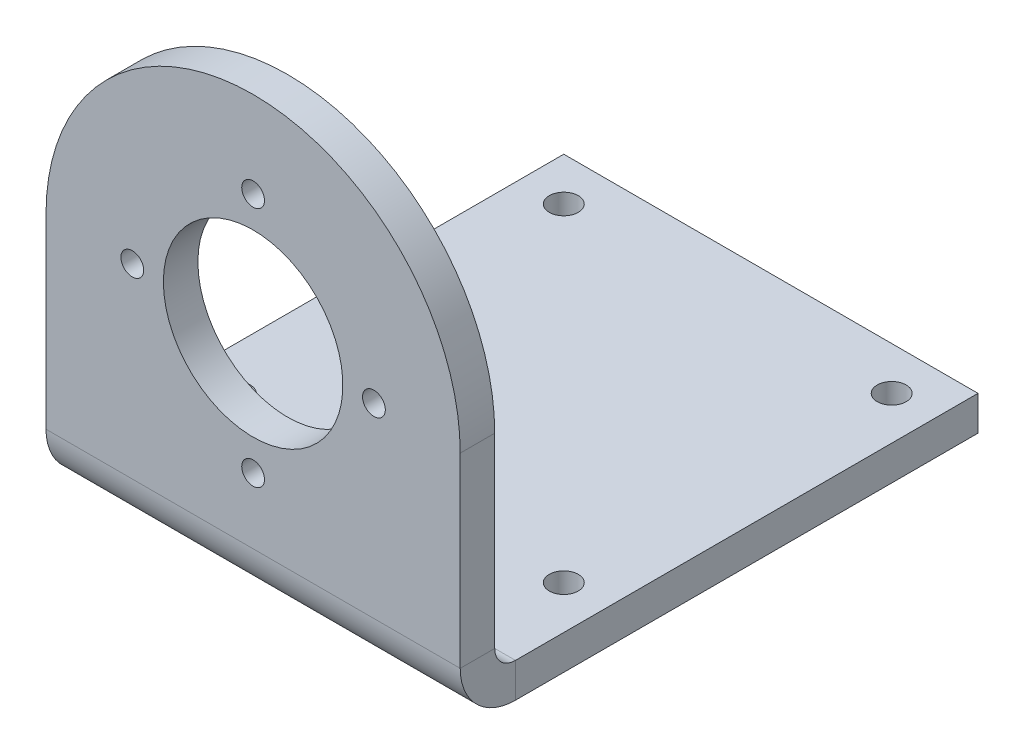
ISO-10303-21;
HEADER;
FILE_DESCRIPTION(('STEP AP214'),'2;1');
FILE_NAME('part.step','',(''),(''),'','','');
FILE_SCHEMA(('AUTOMOTIVE_DESIGN { 1 0 10303 214 1 1 1 1 }'));
ENDSEC;
DATA;
#1=APPLICATION_CONTEXT('core data for automotive mechanical design processes');
#2=APPLICATION_PROTOCOL_DEFINITION('international standard','automotive_design',2000,#1);
#3=PRODUCT_CONTEXT('',#1,'mechanical');
#4=PRODUCT('Part','Part','',(#3));
#5=PRODUCT_RELATED_PRODUCT_CATEGORY('part','',(#4));
#6=PRODUCT_DEFINITION_FORMATION('','',#4);
#7=PRODUCT_DEFINITION_CONTEXT('part definition',#1,'design');
#8=PRODUCT_DEFINITION('design','',#6,#7);
#9=PRODUCT_DEFINITION_SHAPE('','',#8);
#10=(LENGTH_UNIT() NAMED_UNIT(*) SI_UNIT(.MILLI.,.METRE.));
#11=(NAMED_UNIT(*) PLANE_ANGLE_UNIT() SI_UNIT($,.RADIAN.));
#12=(NAMED_UNIT(*) SI_UNIT($,.STERADIAN.) SOLID_ANGLE_UNIT());
#13=UNCERTAINTY_MEASURE_WITH_UNIT(LENGTH_MEASURE(1.E-05),#10,'distance_accuracy_value','');
#14=(GEOMETRIC_REPRESENTATION_CONTEXT(3) GLOBAL_UNCERTAINTY_ASSIGNED_CONTEXT((#13)) GLOBAL_UNIT_ASSIGNED_CONTEXT((#10,
#11,#12)) REPRESENTATION_CONTEXT('',''));
#15=CARTESIAN_POINT('',(0.,0.,0.));
#16=DIRECTION('',(0.,0.,1.));
#17=DIRECTION('',(1.,0.,0.));
#18=AXIS2_PLACEMENT_3D('',#15,#16,#17);
#19=CARTESIAN_POINT('',(-30.,-30.,-5.));
#20=DIRECTION('',(-1.,0.,0.));
#21=DIRECTION('',(0.,0.,1.));
#22=AXIS2_PLACEMENT_3D('',#19,#20,#21);
#23=PLANE('',#22);
#24=DIRECTION('',(0.,-1.,0.));
#25=VECTOR('',#24,1.);
#26=CARTESIAN_POINT('',(-30.,-30.,0.));
#27=LINE('',#26,#25);
#28=CARTESIAN_POINT('',(-30.,0.,0.));
#29=VERTEX_POINT('',#28);
#30=CARTESIAN_POINT('',(-30.,-27.,0.));
#31=VERTEX_POINT('',#30);
#32=EDGE_CURVE('E70',#29,#31,#27,.T.);
#33=ORIENTED_EDGE('',*,*,#32,.F.);
#34=DIRECTION('',(0.,0.,1.));
#35=VECTOR('',#34,1.);
#36=CARTESIAN_POINT('',(-30.,0.,-47.4264068711929));
#37=LINE('',#36,#35);
#38=CARTESIAN_POINT('',(-30.,0.,-5.));
#39=VERTEX_POINT('',#38);
#40=EDGE_CURVE('E142',#39,#29,#37,.T.);
#41=ORIENTED_EDGE('',*,*,#40,.F.);
#42=DIRECTION('',(0.,-1.,0.));
#43=VECTOR('',#42,1.);
#44=CARTESIAN_POINT('',(-30.,-30.,-5.));
#45=LINE('',#44,#43);
#46=CARTESIAN_POINT('',(-30.,-27.,-5.));
#47=VERTEX_POINT('',#46);
#48=EDGE_CURVE('E12',#39,#47,#45,.T.);
#49=ORIENTED_EDGE('',*,*,#48,.T.);
#50=DIRECTION('',(0.,0.,1.));
#51=VECTOR('',#50,1.);
#52=CARTESIAN_POINT('',(-30.,-27.,-5.));
#53=LINE('',#52,#51);
#54=EDGE_CURVE('E159',#47,#31,#53,.T.);
#55=ORIENTED_EDGE('',*,*,#54,.T.);
#56=EDGE_LOOP('',(#33,#41,#49,#55));
#57=FACE_BOUND('',#56,.T.);
#58=ADVANCED_FACE('F66',(#57),#23,.T.);
#59=CARTESIAN_POINT('',(0.,0.,-5.));
#60=DIRECTION('',(0.,0.,-1.));
#61=DIRECTION('',(-1.,0.,0.));
#62=AXIS2_PLACEMENT_3D('',#59,#60,#61);
#63=PLANE('',#62);
#64=CARTESIAN_POINT('',(0.,0.,-5.));
#65=DIRECTION('',(0.,0.,-1.));
#66=DIRECTION('',(-1.,0.,0.));
#67=AXIS2_PLACEMENT_3D('',#64,#65,#66);
#68=CIRCLE('',#67,30.);
#69=CARTESIAN_POINT('',(30.,0.,-5.));
#70=VERTEX_POINT('',#69);
#71=EDGE_CURVE('E134',#39,#70,#68,.T.);
#72=ORIENTED_EDGE('',*,*,#71,.T.);
#73=DIRECTION('',(0.,1.,0.));
#74=VECTOR('',#73,1.);
#75=CARTESIAN_POINT('',(30.,-30.,-5.));
#76=LINE('',#75,#74);
#77=CARTESIAN_POINT('',(30.,-27.,-5.));
#78=VERTEX_POINT('',#77);
#79=EDGE_CURVE('E76',#78,#70,#76,.T.);
#80=ORIENTED_EDGE('',*,*,#79,.F.);
#81=DIRECTION('',(-1.,0.,0.));
#82=VECTOR('',#81,1.);
#83=CARTESIAN_POINT('',(-30.,-27.,-5.));
#84=LINE('',#83,#82);
#85=EDGE_CURVE('E179',#47,#78,#84,.F.);
#86=ORIENTED_EDGE('',*,*,#85,.F.);
#87=ORIENTED_EDGE('',*,*,#48,.F.);
#88=EDGE_LOOP('',(#72,#80,#86,#87));
#89=FACE_BOUND('',#88,.T.);
#90=CARTESIAN_POINT('',(17.5,0.,-5.));
#91=DIRECTION('',(0.,0.,-1.));
#92=DIRECTION('',(-1.,0.,0.));
#93=AXIS2_PLACEMENT_3D('',#90,#91,#92);
#94=CIRCLE('',#93,1.65);
#95=CARTESIAN_POINT('',(15.85,0.,-5.));
#96=VERTEX_POINT('',#95);
#97=EDGE_CURVE('E247',#96,#96,#94,.T.);
#98=ORIENTED_EDGE('',*,*,#97,.F.);
#99=EDGE_LOOP('',(#98));
#100=FACE_BOUND('',#99,.T.);
#101=CARTESIAN_POINT('',(0.,17.5,-5.));
#102=DIRECTION('',(0.,0.,-1.));
#103=DIRECTION('',(-1.,0.,0.));
#104=AXIS2_PLACEMENT_3D('',#101,#102,#103);
#105=CIRCLE('',#104,1.65);
#106=CARTESIAN_POINT('',(-1.65,17.5,-5.));
#107=VERTEX_POINT('',#106);
#108=EDGE_CURVE('E237',#107,#107,#105,.T.);
#109=ORIENTED_EDGE('',*,*,#108,.F.);
#110=EDGE_LOOP('',(#109));
#111=FACE_BOUND('',#110,.T.);
#112=CARTESIAN_POINT('',(0.,-17.5,-5.));
#113=DIRECTION('',(0.,0.,-1.));
#114=DIRECTION('',(-1.,0.,0.));
#115=AXIS2_PLACEMENT_3D('',#112,#113,#114);
#116=CIRCLE('',#115,1.65);
#117=CARTESIAN_POINT('',(-1.65,-17.5,-5.));
#118=VERTEX_POINT('',#117);
#119=EDGE_CURVE('E246',#118,#118,#116,.T.);
#120=ORIENTED_EDGE('',*,*,#119,.F.);
#121=EDGE_LOOP('',(#120));
#122=FACE_BOUND('',#121,.T.);
#123=CARTESIAN_POINT('',(0.,0.,-5.));
#124=DIRECTION('',(0.,0.,-1.));
#125=DIRECTION('',(-1.,0.,0.));
#126=AXIS2_PLACEMENT_3D('',#123,#124,#125);
#127=CIRCLE('',#126,13.);
#128=CARTESIAN_POINT('',(-13.,0.,-5.));
#129=VERTEX_POINT('',#128);
#130=EDGE_CURVE('E255',#129,#129,#127,.T.);
#131=ORIENTED_EDGE('',*,*,#130,.F.);
#132=EDGE_LOOP('',(#131));
#133=FACE_BOUND('',#132,.T.);
#134=CARTESIAN_POINT('',(-17.5,0.,-5.));
#135=DIRECTION('',(0.,0.,-1.));
#136=DIRECTION('',(-1.,0.,0.));
#137=AXIS2_PLACEMENT_3D('',#134,#135,#136);
#138=CIRCLE('',#137,1.65);
#139=CARTESIAN_POINT('',(-19.15,0.,-5.));
#140=VERTEX_POINT('',#139);
#141=EDGE_CURVE('E232',#140,#140,#138,.T.);
#142=ORIENTED_EDGE('',*,*,#141,.F.);
#143=EDGE_LOOP('',(#142));
#144=FACE_BOUND('',#143,.T.);
#145=ADVANCED_FACE('F136',(#89,#100,#111,#122,#133,#144),#63,.T.);
#146=CARTESIAN_POINT('',(0.,0.,0.));
#147=DIRECTION('',(0.,0.,-1.));
#148=DIRECTION('',(-1.,0.,0.));
#149=AXIS2_PLACEMENT_3D('',#146,#147,#148);
#150=PLANE('',#149);
#151=CARTESIAN_POINT('',(-17.5,0.,0.));
#152=DIRECTION('',(0.,0.,-1.));
#153=DIRECTION('',(-1.,0.,0.));
#154=AXIS2_PLACEMENT_3D('',#151,#152,#153);
#155=CIRCLE('',#154,1.65);
#156=CARTESIAN_POINT('',(-19.15,0.,0.));
#157=VERTEX_POINT('',#156);
#158=EDGE_CURVE('E251',#157,#157,#155,.T.);
#159=ORIENTED_EDGE('',*,*,#158,.T.);
#160=EDGE_LOOP('',(#159));
#161=FACE_BOUND('',#160,.T.);
#162=CARTESIAN_POINT('',(0.,0.,0.));
#163=DIRECTION('',(0.,0.,-1.));
#164=DIRECTION('',(-1.,0.,0.));
#165=AXIS2_PLACEMENT_3D('',#162,#163,#164);
#166=CIRCLE('',#165,13.);
#167=CARTESIAN_POINT('',(-13.,0.,0.));
#168=VERTEX_POINT('',#167);
#169=EDGE_CURVE('E260',#168,#168,#166,.T.);
#170=ORIENTED_EDGE('',*,*,#169,.T.);
#171=EDGE_LOOP('',(#170));
#172=FACE_BOUND('',#171,.T.);
#173=CARTESIAN_POINT('',(0.,-17.5,0.));
#174=DIRECTION('',(0.,0.,-1.));
#175=DIRECTION('',(-1.,0.,0.));
#176=AXIS2_PLACEMENT_3D('',#173,#174,#175);
#177=CIRCLE('',#176,1.65);
#178=CARTESIAN_POINT('',(-1.65,-17.5,0.));
#179=VERTEX_POINT('',#178);
#180=EDGE_CURVE('E259',#179,#179,#177,.T.);
#181=ORIENTED_EDGE('',*,*,#180,.T.);
#182=EDGE_LOOP('',(#181));
#183=FACE_BOUND('',#182,.T.);
#184=CARTESIAN_POINT('',(0.,17.5,0.));
#185=DIRECTION('',(0.,0.,-1.));
#186=DIRECTION('',(-1.,0.,0.));
#187=AXIS2_PLACEMENT_3D('',#184,#185,#186);
#188=CIRCLE('',#187,1.65);
#189=CARTESIAN_POINT('',(-1.65,17.5,0.));
#190=VERTEX_POINT('',#189);
#191=EDGE_CURVE('E242',#190,#190,#188,.T.);
#192=ORIENTED_EDGE('',*,*,#191,.T.);
#193=EDGE_LOOP('',(#192));
#194=FACE_BOUND('',#193,.T.);
#195=CARTESIAN_POINT('',(17.5,0.,0.));
#196=DIRECTION('',(0.,0.,-1.));
#197=DIRECTION('',(-1.,0.,0.));
#198=AXIS2_PLACEMENT_3D('',#195,#196,#197);
#199=CIRCLE('',#198,1.65);
#200=CARTESIAN_POINT('',(15.85,0.,0.));
#201=VERTEX_POINT('',#200);
#202=EDGE_CURVE('E241',#201,#201,#199,.T.);
#203=ORIENTED_EDGE('',*,*,#202,.T.);
#204=EDGE_LOOP('',(#203));
#205=FACE_BOUND('',#204,.T.);
#206=DIRECTION('',(0.,1.,0.));
#207=VECTOR('',#206,1.);
#208=CARTESIAN_POINT('',(30.,-30.,0.));
#209=LINE('',#208,#207);
#210=CARTESIAN_POINT('',(30.,-27.,0.));
#211=VERTEX_POINT('',#210);
#212=CARTESIAN_POINT('',(30.,0.,0.));
#213=VERTEX_POINT('',#212);
#214=EDGE_CURVE('E157',#211,#213,#209,.T.);
#215=ORIENTED_EDGE('',*,*,#214,.T.);
#216=CARTESIAN_POINT('',(0.,0.,0.));
#217=DIRECTION('',(0.,0.,-1.));
#218=DIRECTION('',(-1.,0.,0.));
#219=AXIS2_PLACEMENT_3D('',#216,#217,#218);
#220=CIRCLE('',#219,30.);
#221=EDGE_CURVE('E148',#29,#213,#220,.T.);
#222=ORIENTED_EDGE('',*,*,#221,.F.);
#223=ORIENTED_EDGE('',*,*,#32,.T.);
#224=DIRECTION('',(-1.,0.,0.));
#225=VECTOR('',#224,1.);
#226=CARTESIAN_POINT('',(-30.,-27.,0.));
#227=LINE('',#226,#225);
#228=EDGE_CURVE('E191',#31,#211,#227,.F.);
#229=ORIENTED_EDGE('',*,*,#228,.T.);
#230=EDGE_LOOP('',(#215,#222,#223,#229));
#231=FACE_BOUND('',#230,.T.);
#232=ADVANCED_FACE('F308',(#161,#172,#183,#194,#205,#231),#150,.F.);
#233=CARTESIAN_POINT('',(30.,-30.,-5.));
#234=DIRECTION('',(1.,0.,0.));
#235=DIRECTION('',(0.,0.,-1.));
#236=AXIS2_PLACEMENT_3D('',#233,#234,#235);
#237=PLANE('',#236);
#238=DIRECTION('',(0.,0.,1.));
#239=VECTOR('',#238,1.);
#240=CARTESIAN_POINT('',(30.,0.,-47.4264068711929));
#241=LINE('',#240,#239);
#242=EDGE_CURVE('E145',#70,#213,#241,.T.);
#243=ORIENTED_EDGE('',*,*,#242,.T.);
#244=ORIENTED_EDGE('',*,*,#214,.F.);
#245=DIRECTION('',(0.,0.,1.));
#246=VECTOR('',#245,1.);
#247=CARTESIAN_POINT('',(30.,-27.,-5.));
#248=LINE('',#247,#246);
#249=EDGE_CURVE('E90',#78,#211,#248,.T.);
#250=ORIENTED_EDGE('',*,*,#249,.F.);
#251=ORIENTED_EDGE('',*,*,#79,.T.);
#252=EDGE_LOOP('',(#243,#244,#250,#251));
#253=FACE_BOUND('',#252,.T.);
#254=ADVANCED_FACE('F68',(#253),#237,.T.);
#255=CARTESIAN_POINT('',(30.,-27.,-8.));
#256=DIRECTION('',(1.,0.,0.));
#257=DIRECTION('',(0.,0.,-1.));
#258=AXIS2_PLACEMENT_3D('',#255,#256,#257);
#259=PLANE('',#258);
#260=DIRECTION('',(0.,-1.,0.));
#261=VECTOR('',#260,1.);
#262=CARTESIAN_POINT('',(30.,-30.,-7.99999999999999));
#263=LINE('',#262,#261);
#264=CARTESIAN_POINT('',(30.,-30.,-7.99999999999999));
#265=VERTEX_POINT('',#264);
#266=CARTESIAN_POINT('',(30.,-35.,-7.99999999999997));
#267=VERTEX_POINT('',#266);
#268=EDGE_CURVE('E228',#265,#267,#263,.T.);
#269=ORIENTED_EDGE('',*,*,#268,.F.);
#270=CARTESIAN_POINT('',(30.,-27.,-8.));
#271=DIRECTION('',(-1.,0.,0.));
#272=DIRECTION('',(0.,0.,1.));
#273=AXIS2_PLACEMENT_3D('',#270,#271,#272);
#274=CIRCLE('',#273,3.);
#275=EDGE_CURVE('E183',#78,#265,#274,.F.);
#276=ORIENTED_EDGE('',*,*,#275,.F.);
#277=ORIENTED_EDGE('',*,*,#249,.T.);
#278=CARTESIAN_POINT('',(30.,-27.,-8.));
#279=DIRECTION('',(-1.,0.,0.));
#280=DIRECTION('',(0.,0.,1.));
#281=AXIS2_PLACEMENT_3D('',#278,#279,#280);
#282=CIRCLE('',#281,8.);
#283=EDGE_CURVE('E173',#211,#267,#282,.F.);
#284=ORIENTED_EDGE('',*,*,#283,.T.);
#285=EDGE_LOOP('',(#269,#276,#277,#284));
#286=FACE_BOUND('',#285,.T.);
#287=ADVANCED_FACE('F332',(#286),#259,.T.);
#288=CARTESIAN_POINT('',(-30.,-27.,-8.));
#289=DIRECTION('',(1.,0.,0.));
#290=DIRECTION('',(0.,0.,-1.));
#291=AXIS2_PLACEMENT_3D('',#288,#289,#290);
#292=PLANE('',#291);
#293=CARTESIAN_POINT('',(-30.,-27.,-8.));
#294=DIRECTION('',(-1.,0.,0.));
#295=DIRECTION('',(0.,0.,1.));
#296=AXIS2_PLACEMENT_3D('',#293,#294,#295);
#297=CIRCLE('',#296,3.);
#298=CARTESIAN_POINT('',(-30.,-30.,-7.99999999999999));
#299=VERTEX_POINT('',#298);
#300=EDGE_CURVE('E175',#299,#47,#297,.T.);
#301=ORIENTED_EDGE('',*,*,#300,.F.);
#302=DIRECTION('',(0.,-1.,0.));
#303=VECTOR('',#302,1.);
#304=CARTESIAN_POINT('',(-30.,-30.,-7.99999999999999));
#305=LINE('',#304,#303);
#306=CARTESIAN_POINT('',(-30.,-35.,-7.99999999999997));
#307=VERTEX_POINT('',#306);
#308=EDGE_CURVE('E227',#299,#307,#305,.T.);
#309=ORIENTED_EDGE('',*,*,#308,.T.);
#310=CARTESIAN_POINT('',(-30.,-27.,-8.));
#311=DIRECTION('',(-1.,0.,0.));
#312=DIRECTION('',(0.,0.,1.));
#313=AXIS2_PLACEMENT_3D('',#310,#311,#312);
#314=CIRCLE('',#313,8.);
#315=EDGE_CURVE('E187',#307,#31,#314,.T.);
#316=ORIENTED_EDGE('',*,*,#315,.T.);
#317=ORIENTED_EDGE('',*,*,#54,.F.);
#318=EDGE_LOOP('',(#301,#309,#316,#317));
#319=FACE_BOUND('',#318,.T.);
#320=ADVANCED_FACE('F315',(#319),#292,.F.);
#321=CARTESIAN_POINT('',(-30.,-27.,-8.));
#322=DIRECTION('',(-1.,0.,0.));
#323=DIRECTION('',(0.,-1.,0.));
#324=AXIS2_PLACEMENT_3D('',#321,#322,#323);
#325=CYLINDRICAL_SURFACE('',#324,8.);
#326=ORIENTED_EDGE('',*,*,#228,.F.);
#327=ORIENTED_EDGE('',*,*,#315,.F.);
#328=DIRECTION('',(-1.,0.,0.));
#329=VECTOR('',#328,1.);
#330=CARTESIAN_POINT('',(0.,-35.,-7.99999999999997));
#331=LINE('',#330,#329);
#332=EDGE_CURVE('E214',#267,#307,#331,.T.);
#333=ORIENTED_EDGE('',*,*,#332,.F.);
#334=ORIENTED_EDGE('',*,*,#283,.F.);
#335=EDGE_LOOP('',(#326,#327,#333,#334));
#336=FACE_BOUND('',#335,.T.);
#337=ADVANCED_FACE('F314',(#336),#325,.T.);
#338=CARTESIAN_POINT('',(-30.,-27.,-8.));
#339=DIRECTION('',(-1.,0.,0.));
#340=DIRECTION('',(0.,-1.,0.));
#341=AXIS2_PLACEMENT_3D('',#338,#339,#340);
#342=CYLINDRICAL_SURFACE('',#341,3.);
#343=ORIENTED_EDGE('',*,*,#85,.T.);
#344=ORIENTED_EDGE('',*,*,#275,.T.);
#345=DIRECTION('',(-1.,0.,0.));
#346=VECTOR('',#345,1.);
#347=CARTESIAN_POINT('',(30.,-30.,-7.99999999999999));
#348=LINE('',#347,#346);
#349=EDGE_CURVE('E231',#265,#299,#348,.T.);
#350=ORIENTED_EDGE('',*,*,#349,.T.);
#351=ORIENTED_EDGE('',*,*,#300,.T.);
#352=EDGE_LOOP('',(#343,#344,#350,#351));
#353=FACE_BOUND('',#352,.T.);
#354=ADVANCED_FACE('F335',(#353),#342,.F.);
#355=CARTESIAN_POINT('',(-30.,-35.,-4.99999999999998));
#356=DIRECTION('',(-1.,0.,0.));
#357=DIRECTION('',(0.,0.,1.));
#358=AXIS2_PLACEMENT_3D('',#355,#356,#357);
#359=PLANE('',#358);
#360=DIRECTION('',(0.,0.,1.));
#361=VECTOR('',#360,1.);
#362=CARTESIAN_POINT('',(-30.,-35.,-4.99999999999998));
#363=LINE('',#362,#361);
#364=CARTESIAN_POINT('',(-30.,-35.0000000000002,-75.));
#365=VERTEX_POINT('',#364);
#366=EDGE_CURVE('E200',#365,#307,#363,.T.);
#367=ORIENTED_EDGE('',*,*,#366,.T.);
#368=ORIENTED_EDGE('',*,*,#308,.F.);
#369=DIRECTION('',(0.,0.,1.));
#370=VECTOR('',#369,1.);
#371=CARTESIAN_POINT('',(-30.,-30.,-5.));
#372=LINE('',#371,#370);
#373=CARTESIAN_POINT('',(-30.,-30.0000000000002,-75.));
#374=VERTEX_POINT('',#373);
#375=EDGE_CURVE('E203',#374,#299,#372,.T.);
#376=ORIENTED_EDGE('',*,*,#375,.F.);
#377=DIRECTION('',(0.,1.,0.));
#378=VECTOR('',#377,1.);
#379=CARTESIAN_POINT('',(-30.,-35.0000000000002,-75.));
#380=LINE('',#379,#378);
#381=EDGE_CURVE('E180',#365,#374,#380,.T.);
#382=ORIENTED_EDGE('',*,*,#381,.F.);
#383=EDGE_LOOP('',(#367,#368,#376,#382));
#384=FACE_BOUND('',#383,.T.);
#385=ADVANCED_FACE('F324',(#384),#359,.T.);
#386=CARTESIAN_POINT('',(30.,-35.0000000000002,-75.));
#387=DIRECTION('',(1.,0.,0.));
#388=DIRECTION('',(0.,0.,-1.));
#389=AXIS2_PLACEMENT_3D('',#386,#387,#388);
#390=PLANE('',#389);
#391=DIRECTION('',(0.,0.,-1.));
#392=VECTOR('',#391,1.);
#393=CARTESIAN_POINT('',(30.,-30.0000000000002,-75.));
#394=LINE('',#393,#392);
#395=CARTESIAN_POINT('',(30.,-30.0000000000002,-75.));
#396=VERTEX_POINT('',#395);
#397=EDGE_CURVE('E211',#265,#396,#394,.T.);
#398=ORIENTED_EDGE('',*,*,#397,.F.);
#399=ORIENTED_EDGE('',*,*,#268,.T.);
#400=DIRECTION('',(0.,0.,-1.));
#401=VECTOR('',#400,1.);
#402=CARTESIAN_POINT('',(30.,-35.0000000000002,-75.));
#403=LINE('',#402,#401);
#404=CARTESIAN_POINT('',(30.,-35.0000000000002,-75.));
#405=VERTEX_POINT('',#404);
#406=EDGE_CURVE('E207',#267,#405,#403,.T.);
#407=ORIENTED_EDGE('',*,*,#406,.T.);
#408=DIRECTION('',(0.,1.,0.));
#409=VECTOR('',#408,1.);
#410=CARTESIAN_POINT('',(30.,-35.0000000000002,-75.));
#411=LINE('',#410,#409);
#412=EDGE_CURVE('E196',#405,#396,#411,.T.);
#413=ORIENTED_EDGE('',*,*,#412,.T.);
#414=EDGE_LOOP('',(#398,#399,#407,#413));
#415=FACE_BOUND('',#414,.T.);
#416=ADVANCED_FACE('F331',(#415),#390,.T.);
#417=CARTESIAN_POINT('',(0.,-35.,1.21540815252824E-13));
#418=DIRECTION('',(0.,-1.,0.));
#419=DIRECTION('',(0.,0.,-1.));
#420=AXIS2_PLACEMENT_3D('',#417,#418,#419);
#421=PLANE('',#420);
#422=CARTESIAN_POINT('',(23.75,-35.0000000000001,-21.25));
#423=DIRECTION('',(0.,-1.,0.));
#424=DIRECTION('',(0.,0.,-1.));
#425=AXIS2_PLACEMENT_3D('',#422,#423,#424);
#426=CIRCLE('',#425,2.1);
#427=CARTESIAN_POINT('',(23.75,-35.,-19.15));
#428=VERTEX_POINT('',#427);
#429=EDGE_CURVE('E282',#428,#428,#426,.T.);
#430=ORIENTED_EDGE('',*,*,#429,.F.);
#431=EDGE_LOOP('',(#430));
#432=FACE_BOUND('',#431,.T.);
#433=CARTESIAN_POINT('',(23.75,-35.0000000000002,-68.75));
#434=DIRECTION('',(0.,-1.,0.));
#435=DIRECTION('',(0.,0.,-1.));
#436=AXIS2_PLACEMENT_3D('',#433,#434,#435);
#437=CIRCLE('',#436,2.1);
#438=CARTESIAN_POINT('',(23.75,-35.0000000000002,-66.65));
#439=VERTEX_POINT('',#438);
#440=EDGE_CURVE('E290',#439,#439,#437,.T.);
#441=ORIENTED_EDGE('',*,*,#440,.F.);
#442=EDGE_LOOP('',(#441));
#443=FACE_BOUND('',#442,.T.);
#444=CARTESIAN_POINT('',(-23.75,-35.0000000000002,-68.75));
#445=DIRECTION('',(0.,-1.,0.));
#446=DIRECTION('',(0.,0.,-1.));
#447=AXIS2_PLACEMENT_3D('',#444,#445,#446);
#448=CIRCLE('',#447,2.1);
#449=CARTESIAN_POINT('',(-23.75,-35.0000000000002,-66.65));
#450=VERTEX_POINT('',#449);
#451=EDGE_CURVE('E281',#450,#450,#448,.T.);
#452=ORIENTED_EDGE('',*,*,#451,.F.);
#453=EDGE_LOOP('',(#452));
#454=FACE_BOUND('',#453,.T.);
#455=CARTESIAN_POINT('',(-23.75,-35.0000000000001,-21.25));
#456=DIRECTION('',(0.,-1.,0.));
#457=DIRECTION('',(0.,0.,-1.));
#458=AXIS2_PLACEMENT_3D('',#455,#456,#457);
#459=CIRCLE('',#458,2.1);
#460=CARTESIAN_POINT('',(-23.75,-35.,-19.15));
#461=VERTEX_POINT('',#460);
#462=EDGE_CURVE('E263',#461,#461,#459,.T.);
#463=ORIENTED_EDGE('',*,*,#462,.F.);
#464=EDGE_LOOP('',(#463));
#465=FACE_BOUND('',#464,.T.);
#466=ORIENTED_EDGE('',*,*,#406,.F.);
#467=ORIENTED_EDGE('',*,*,#332,.T.);
#468=ORIENTED_EDGE('',*,*,#366,.F.);
#469=DIRECTION('',(-1.,0.,0.));
#470=VECTOR('',#469,1.);
#471=CARTESIAN_POINT('',(-30.,-35.0000000000002,-75.));
#472=LINE('',#471,#470);
#473=EDGE_CURVE('E218',#405,#365,#472,.T.);
#474=ORIENTED_EDGE('',*,*,#473,.F.);
#475=EDGE_LOOP('',(#466,#467,#468,#474));
#476=FACE_BOUND('',#475,.T.);
#477=ADVANCED_FACE('F322',(#432,#443,#454,#465,#476),#421,.T.);
#478=CARTESIAN_POINT('',(0.,-30.,1.04083408558608E-13));
#479=DIRECTION('',(0.,-1.,0.));
#480=DIRECTION('',(0.,0.,-1.));
#481=AXIS2_PLACEMENT_3D('',#478,#479,#480);
#482=PLANE('',#481);
#483=CARTESIAN_POINT('',(23.75,-30.0000000000001,-21.25));
#484=DIRECTION('',(0.,-1.,0.));
#485=DIRECTION('',(0.,0.,-1.));
#486=AXIS2_PLACEMENT_3D('',#483,#484,#485);
#487=CIRCLE('',#486,2.1);
#488=CARTESIAN_POINT('',(23.75,-30.,-19.15));
#489=VERTEX_POINT('',#488);
#490=EDGE_CURVE('E141',#489,#489,#487,.T.);
#491=ORIENTED_EDGE('',*,*,#490,.T.);
#492=EDGE_LOOP('',(#491));
#493=FACE_BOUND('',#492,.T.);
#494=CARTESIAN_POINT('',(23.75,-30.0000000000002,-68.75));
#495=DIRECTION('',(0.,-1.,0.));
#496=DIRECTION('',(0.,0.,-1.));
#497=AXIS2_PLACEMENT_3D('',#494,#495,#496);
#498=CIRCLE('',#497,2.1);
#499=CARTESIAN_POINT('',(23.75,-30.0000000000002,-66.65));
#500=VERTEX_POINT('',#499);
#501=EDGE_CURVE('E286',#500,#500,#498,.T.);
#502=ORIENTED_EDGE('',*,*,#501,.T.);
#503=EDGE_LOOP('',(#502));
#504=FACE_BOUND('',#503,.T.);
#505=CARTESIAN_POINT('',(-23.75,-30.0000000000002,-68.75));
#506=DIRECTION('',(0.,-1.,0.));
#507=DIRECTION('',(0.,0.,-1.));
#508=AXIS2_PLACEMENT_3D('',#505,#506,#507);
#509=CIRCLE('',#508,2.1);
#510=CARTESIAN_POINT('',(-23.75,-30.0000000000002,-66.65));
#511=VERTEX_POINT('',#510);
#512=EDGE_CURVE('E294',#511,#511,#509,.T.);
#513=ORIENTED_EDGE('',*,*,#512,.T.);
#514=EDGE_LOOP('',(#513));
#515=FACE_BOUND('',#514,.T.);
#516=CARTESIAN_POINT('',(-23.75,-30.0000000000001,-21.25));
#517=DIRECTION('',(0.,-1.,0.));
#518=DIRECTION('',(0.,0.,-1.));
#519=AXIS2_PLACEMENT_3D('',#516,#517,#518);
#520=CIRCLE('',#519,2.1);
#521=CARTESIAN_POINT('',(-23.75,-30.,-19.15));
#522=VERTEX_POINT('',#521);
#523=EDGE_CURVE('E277',#522,#522,#520,.T.);
#524=ORIENTED_EDGE('',*,*,#523,.T.);
#525=EDGE_LOOP('',(#524));
#526=FACE_BOUND('',#525,.T.);
#527=ORIENTED_EDGE('',*,*,#349,.F.);
#528=ORIENTED_EDGE('',*,*,#397,.T.);
#529=DIRECTION('',(-1.,0.,0.));
#530=VECTOR('',#529,1.);
#531=CARTESIAN_POINT('',(-30.,-30.0000000000002,-75.));
#532=LINE('',#531,#530);
#533=EDGE_CURVE('E208',#396,#374,#532,.T.);
#534=ORIENTED_EDGE('',*,*,#533,.T.);
#535=ORIENTED_EDGE('',*,*,#375,.T.);
#536=EDGE_LOOP('',(#527,#528,#534,#535));
#537=FACE_BOUND('',#536,.T.);
#538=ADVANCED_FACE('F337',(#493,#504,#515,#526,#537),#482,.F.);
#539=CARTESIAN_POINT('',(-30.,-35.0000000000002,-75.));
#540=DIRECTION('',(0.,0.,-1.));
#541=DIRECTION('',(0.,1.,0.));
#542=AXIS2_PLACEMENT_3D('',#539,#540,#541);
#543=PLANE('',#542);
#544=ORIENTED_EDGE('',*,*,#533,.F.);
#545=ORIENTED_EDGE('',*,*,#412,.F.);
#546=ORIENTED_EDGE('',*,*,#473,.T.);
#547=ORIENTED_EDGE('',*,*,#381,.T.);
#548=EDGE_LOOP('',(#544,#545,#546,#547));
#549=FACE_BOUND('',#548,.T.);
#550=ADVANCED_FACE('F328',(#549),#543,.T.);
#551=CARTESIAN_POINT('',(17.5,0.,-41.7695526217005));
#552=DIRECTION('',(0.,0.,1.));
#553=DIRECTION('',(1.,0.,0.));
#554=AXIS2_PLACEMENT_3D('',#551,#552,#553);
#555=CYLINDRICAL_SURFACE('',#554,1.65);
#556=ORIENTED_EDGE('',*,*,#202,.F.);
#557=EDGE_LOOP('',(#556));
#558=FACE_BOUND('',#557,.T.);
#559=ORIENTED_EDGE('',*,*,#97,.T.);
#560=EDGE_LOOP('',(#559));
#561=FACE_BOUND('',#560,.T.);
#562=ADVANCED_FACE('F345',(#558,#561),#555,.F.);
#563=CARTESIAN_POINT('',(0.,17.5,-41.7695526217005));
#564=DIRECTION('',(0.,0.,1.));
#565=DIRECTION('',(1.,0.,0.));
#566=AXIS2_PLACEMENT_3D('',#563,#564,#565);
#567=CYLINDRICAL_SURFACE('',#566,1.65);
#568=ORIENTED_EDGE('',*,*,#191,.F.);
#569=EDGE_LOOP('',(#568));
#570=FACE_BOUND('',#569,.T.);
#571=ORIENTED_EDGE('',*,*,#108,.T.);
#572=EDGE_LOOP('',(#571));
#573=FACE_BOUND('',#572,.T.);
#574=ADVANCED_FACE('F397',(#570,#573),#567,.F.);
#575=CARTESIAN_POINT('',(0.,-17.5,-41.7695526217005));
#576=DIRECTION('',(0.,0.,1.));
#577=DIRECTION('',(1.,0.,0.));
#578=AXIS2_PLACEMENT_3D('',#575,#576,#577);
#579=CYLINDRICAL_SURFACE('',#578,1.65);
#580=ORIENTED_EDGE('',*,*,#180,.F.);
#581=EDGE_LOOP('',(#580));
#582=FACE_BOUND('',#581,.T.);
#583=ORIENTED_EDGE('',*,*,#119,.T.);
#584=EDGE_LOOP('',(#583));
#585=FACE_BOUND('',#584,.T.);
#586=ADVANCED_FACE('F406',(#582,#585),#579,.F.);
#587=CARTESIAN_POINT('',(0.,0.,-41.7695526217005));
#588=DIRECTION('',(0.,0.,1.));
#589=DIRECTION('',(1.,0.,0.));
#590=AXIS2_PLACEMENT_3D('',#587,#588,#589);
#591=CYLINDRICAL_SURFACE('',#590,13.);
#592=ORIENTED_EDGE('',*,*,#169,.F.);
#593=EDGE_LOOP('',(#592));
#594=FACE_BOUND('',#593,.T.);
#595=ORIENTED_EDGE('',*,*,#130,.T.);
#596=EDGE_LOOP('',(#595));
#597=FACE_BOUND('',#596,.T.);
#598=ADVANCED_FACE('F415',(#594,#597),#591,.F.);
#599=CARTESIAN_POINT('',(-17.5,0.,-41.7695526217005));
#600=DIRECTION('',(0.,0.,1.));
#601=DIRECTION('',(1.,0.,0.));
#602=AXIS2_PLACEMENT_3D('',#599,#600,#601);
#603=CYLINDRICAL_SURFACE('',#602,1.65);
#604=ORIENTED_EDGE('',*,*,#158,.F.);
#605=EDGE_LOOP('',(#604));
#606=FACE_BOUND('',#605,.T.);
#607=ORIENTED_EDGE('',*,*,#141,.T.);
#608=EDGE_LOOP('',(#607));
#609=FACE_BOUND('',#608,.T.);
#610=ADVANCED_FACE('F424',(#606,#609),#603,.F.);
#611=CARTESIAN_POINT('',(-23.75,-40.9396969619671,-21.25));
#612=DIRECTION('',(0.,1.,0.));
#613=DIRECTION('',(0.,0.,1.));
#614=AXIS2_PLACEMENT_3D('',#611,#612,#613);
#615=CYLINDRICAL_SURFACE('',#614,2.1);
#616=CARTESIAN_POINT('',(-23.75,-30.,-19.15));
#617=CARTESIAN_POINT('',(-23.75,-30.0520833333334,-19.15));
#618=CARTESIAN_POINT('',(-23.75,-30.1041666666667,-19.15));
#619=CARTESIAN_POINT('',(-23.75,-30.2083333333334,-19.15));
#620=CARTESIAN_POINT('',(-23.75,-30.2604166666667,-19.15));
#621=CARTESIAN_POINT('',(-23.75,-30.3645833333334,-19.15));
#622=CARTESIAN_POINT('',(-23.75,-30.4166666666667,-19.15));
#623=CARTESIAN_POINT('',(-23.75,-30.5208333333334,-19.15));
#624=CARTESIAN_POINT('',(-23.75,-30.5729166666667,-19.15));
#625=CARTESIAN_POINT('',(-23.75,-30.6770833333334,-19.15));
#626=CARTESIAN_POINT('',(-23.75,-30.7291666666667,-19.15));
#627=CARTESIAN_POINT('',(-23.75,-30.8333333333334,-19.15));
#628=CARTESIAN_POINT('',(-23.75,-30.8854166666667,-19.15));
#629=CARTESIAN_POINT('',(-23.75,-30.9895833333334,-19.15));
#630=CARTESIAN_POINT('',(-23.75,-31.0416666666667,-19.15));
#631=CARTESIAN_POINT('',(-23.75,-31.1458333333334,-19.15));
#632=CARTESIAN_POINT('',(-23.75,-31.1979166666667,-19.15));
#633=CARTESIAN_POINT('',(-23.75,-31.3020833333334,-19.15));
#634=CARTESIAN_POINT('',(-23.75,-31.3541666666667,-19.15));
#635=CARTESIAN_POINT('',(-23.75,-31.4583333333334,-19.15));
#636=CARTESIAN_POINT('',(-23.75,-31.5104166666667,-19.15));
#637=CARTESIAN_POINT('',(-23.75,-31.6145833333334,-19.15));
#638=CARTESIAN_POINT('',(-23.75,-31.6666666666667,-19.15));
#639=CARTESIAN_POINT('',(-23.75,-31.7708333333334,-19.15));
#640=CARTESIAN_POINT('',(-23.75,-31.8229166666667,-19.15));
#641=CARTESIAN_POINT('',(-23.75,-31.9270833333334,-19.15));
#642=CARTESIAN_POINT('',(-23.75,-31.9791666666667,-19.15));
#643=CARTESIAN_POINT('',(-23.75,-32.0833333333334,-19.15));
#644=CARTESIAN_POINT('',(-23.75,-32.1354166666667,-19.15));
#645=CARTESIAN_POINT('',(-23.75,-32.2395833333334,-19.15));
#646=CARTESIAN_POINT('',(-23.75,-32.2916666666667,-19.15));
#647=CARTESIAN_POINT('',(-23.75,-32.3958333333334,-19.15));
#648=CARTESIAN_POINT('',(-23.75,-32.4479166666667,-19.15));
#649=CARTESIAN_POINT('',(-23.75,-32.5520833333334,-19.15));
#650=CARTESIAN_POINT('',(-23.75,-32.6041666666667,-19.15));
#651=CARTESIAN_POINT('',(-23.75,-32.7083333333334,-19.15));
#652=CARTESIAN_POINT('',(-23.75,-32.7604166666667,-19.15));
#653=CARTESIAN_POINT('',(-23.75,-32.8645833333334,-19.15));
#654=CARTESIAN_POINT('',(-23.75,-32.9166666666667,-19.15));
#655=CARTESIAN_POINT('',(-23.75,-33.0208333333334,-19.15));
#656=CARTESIAN_POINT('',(-23.75,-33.0729166666667,-19.15));
#657=CARTESIAN_POINT('',(-23.75,-33.1770833333334,-19.15));
#658=CARTESIAN_POINT('',(-23.75,-33.2291666666667,-19.15));
#659=CARTESIAN_POINT('',(-23.75,-33.3333333333334,-19.15));
#660=CARTESIAN_POINT('',(-23.75,-33.3854166666667,-19.15));
#661=CARTESIAN_POINT('',(-23.75,-33.4895833333334,-19.15));
#662=CARTESIAN_POINT('',(-23.75,-33.5416666666667,-19.15));
#663=CARTESIAN_POINT('',(-23.75,-33.6458333333334,-19.15));
#664=CARTESIAN_POINT('',(-23.75,-33.6979166666667,-19.15));
#665=CARTESIAN_POINT('',(-23.75,-33.8020833333334,-19.15));
#666=CARTESIAN_POINT('',(-23.75,-33.8541666666667,-19.15));
#667=CARTESIAN_POINT('',(-23.75,-33.9583333333334,-19.15));
#668=CARTESIAN_POINT('',(-23.75,-34.0104166666667,-19.15));
#669=CARTESIAN_POINT('',(-23.75,-34.1145833333334,-19.15));
#670=CARTESIAN_POINT('',(-23.75,-34.1666666666667,-19.15));
#671=CARTESIAN_POINT('',(-23.75,-34.2708333333334,-19.15));
#672=CARTESIAN_POINT('',(-23.75,-34.3229166666667,-19.15));
#673=CARTESIAN_POINT('',(-23.75,-34.4270833333334,-19.15));
#674=CARTESIAN_POINT('',(-23.75,-34.4791666666667,-19.15));
#675=CARTESIAN_POINT('',(-23.75,-34.5833333333334,-19.15));
#676=CARTESIAN_POINT('',(-23.75,-34.6354166666667,-19.15));
#677=CARTESIAN_POINT('',(-23.75,-34.7395833333334,-19.15));
#678=CARTESIAN_POINT('',(-23.75,-34.7916666666667,-19.15));
#679=CARTESIAN_POINT('',(-23.75,-34.8958333333334,-19.15));
#680=CARTESIAN_POINT('',(-23.75,-34.9479166666667,-19.15));
#681=CARTESIAN_POINT('',(-23.75,-35.,-19.15));
#682=B_SPLINE_CURVE_WITH_KNOTS('',3,(#616,#617,#618,#619,#620,#621,#622,#623,#624,#625,#626,
#627,#628,#629,#630,#631,#632,#633,#634,#635,#636,#637,#638,#639,#640,#641,#642,#643,#644,#645,
#646,#647,#648,#649,#650,#651,#652,#653,#654,#655,#656,#657,#658,#659,#660,#661,#662,#663,#664,
#665,#666,#667,#668,#669,#670,#671,#672,#673,#674,#675,#676,#677,#678,#679,#680,#681),
.UNSPECIFIED.,.F.,.F.,(4,2,2,2,2,2,2,2,2,2,2,2,2,2,2,2,2,2,2,2,2,2,2,2,2,2,2,2,2,2,2,2,4),(0.,
0.156249999999997,0.3125,0.468749999999997,0.625000000000001,0.781249999999997,
0.937500000000001,1.09375,1.25,1.40625,1.5625,1.71875,1.875,2.03125,2.1875,2.34375,2.5,2.65625,
2.8125,2.96875,3.125,3.28125,3.4375,3.59375,3.75,3.90625,4.0625,4.21875,4.375,4.53125,4.6875,
4.84375,5.),.UNSPECIFIED.);
#683=EDGE_CURVE('BSEAM432',#522,#461,#682,.T.);
#684=ORIENTED_EDGE('',*,*,#523,.F.);
#685=ORIENTED_EDGE('',*,*,#462,.T.);
#686=ORIENTED_EDGE('',*,*,#683,.T.);
#687=ORIENTED_EDGE('',*,*,#683,.F.);
#688=EDGE_LOOP('',(#684,#686,#685,#687));
#689=FACE_BOUND('',#688,.T.);
#690=ADVANCED_FACE('F432',(#689),#615,.F.);
#691=CARTESIAN_POINT('',(-23.75,-40.9396969619672,-68.75));
#692=DIRECTION('',(0.,1.,0.));
#693=DIRECTION('',(0.,0.,1.));
#694=AXIS2_PLACEMENT_3D('',#691,#692,#693);
#695=CYLINDRICAL_SURFACE('',#694,2.1);
#696=CARTESIAN_POINT('',(-23.75,-30.0000000000002,-66.65));
#697=CARTESIAN_POINT('',(-23.75,-30.0520833333335,-66.65));
#698=CARTESIAN_POINT('',(-23.75,-30.1041666666669,-66.65));
#699=CARTESIAN_POINT('',(-23.75,-30.2083333333335,-66.65));
#700=CARTESIAN_POINT('',(-23.75,-30.2604166666669,-66.65));
#701=CARTESIAN_POINT('',(-23.75,-30.3645833333335,-66.65));
#702=CARTESIAN_POINT('',(-23.75,-30.4166666666669,-66.65));
#703=CARTESIAN_POINT('',(-23.75,-30.5208333333335,-66.65));
#704=CARTESIAN_POINT('',(-23.75,-30.5729166666669,-66.65));
#705=CARTESIAN_POINT('',(-23.75,-30.6770833333335,-66.65));
#706=CARTESIAN_POINT('',(-23.75,-30.7291666666669,-66.65));
#707=CARTESIAN_POINT('',(-23.75,-30.8333333333335,-66.65));
#708=CARTESIAN_POINT('',(-23.75,-30.8854166666669,-66.65));
#709=CARTESIAN_POINT('',(-23.75,-30.9895833333335,-66.65));
#710=CARTESIAN_POINT('',(-23.75,-31.0416666666669,-66.65));
#711=CARTESIAN_POINT('',(-23.75,-31.1458333333335,-66.65));
#712=CARTESIAN_POINT('',(-23.75,-31.1979166666669,-66.65));
#713=CARTESIAN_POINT('',(-23.75,-31.3020833333335,-66.65));
#714=CARTESIAN_POINT('',(-23.75,-31.3541666666669,-66.65));
#715=CARTESIAN_POINT('',(-23.75,-31.4583333333335,-66.65));
#716=CARTESIAN_POINT('',(-23.75,-31.5104166666669,-66.65));
#717=CARTESIAN_POINT('',(-23.75,-31.6145833333335,-66.65));
#718=CARTESIAN_POINT('',(-23.75,-31.6666666666669,-66.65));
#719=CARTESIAN_POINT('',(-23.75,-31.7708333333335,-66.65));
#720=CARTESIAN_POINT('',(-23.75,-31.8229166666669,-66.65));
#721=CARTESIAN_POINT('',(-23.75,-31.9270833333335,-66.65));
#722=CARTESIAN_POINT('',(-23.75,-31.9791666666669,-66.65));
#723=CARTESIAN_POINT('',(-23.75,-32.0833333333335,-66.65));
#724=CARTESIAN_POINT('',(-23.75,-32.1354166666669,-66.65));
#725=CARTESIAN_POINT('',(-23.75,-32.2395833333335,-66.65));
#726=CARTESIAN_POINT('',(-23.75,-32.2916666666669,-66.65));
#727=CARTESIAN_POINT('',(-23.75,-32.3958333333335,-66.65));
#728=CARTESIAN_POINT('',(-23.75,-32.4479166666669,-66.65));
#729=CARTESIAN_POINT('',(-23.75,-32.5520833333335,-66.65));
#730=CARTESIAN_POINT('',(-23.75,-32.6041666666669,-66.65));
#731=CARTESIAN_POINT('',(-23.75,-32.7083333333335,-66.65));
#732=CARTESIAN_POINT('',(-23.75,-32.7604166666669,-66.65));
#733=CARTESIAN_POINT('',(-23.75,-32.8645833333335,-66.65));
#734=CARTESIAN_POINT('',(-23.75,-32.9166666666669,-66.65));
#735=CARTESIAN_POINT('',(-23.75,-33.0208333333335,-66.65));
#736=CARTESIAN_POINT('',(-23.75,-33.0729166666669,-66.65));
#737=CARTESIAN_POINT('',(-23.75,-33.1770833333335,-66.65));
#738=CARTESIAN_POINT('',(-23.75,-33.2291666666669,-66.65));
#739=CARTESIAN_POINT('',(-23.75,-33.3333333333335,-66.65));
#740=CARTESIAN_POINT('',(-23.75,-33.3854166666669,-66.65));
#741=CARTESIAN_POINT('',(-23.75,-33.4895833333335,-66.65));
#742=CARTESIAN_POINT('',(-23.75,-33.5416666666669,-66.65));
#743=CARTESIAN_POINT('',(-23.75,-33.6458333333335,-66.65));
#744=CARTESIAN_POINT('',(-23.75,-33.6979166666669,-66.65));
#745=CARTESIAN_POINT('',(-23.75,-33.8020833333335,-66.65));
#746=CARTESIAN_POINT('',(-23.75,-33.8541666666669,-66.65));
#747=CARTESIAN_POINT('',(-23.75,-33.9583333333335,-66.65));
#748=CARTESIAN_POINT('',(-23.75,-34.0104166666669,-66.65));
#749=CARTESIAN_POINT('',(-23.75,-34.1145833333335,-66.65));
#750=CARTESIAN_POINT('',(-23.75,-34.1666666666669,-66.65));
#751=CARTESIAN_POINT('',(-23.75,-34.2708333333335,-66.65));
#752=CARTESIAN_POINT('',(-23.75,-34.3229166666669,-66.65));
#753=CARTESIAN_POINT('',(-23.75,-34.4270833333335,-66.65));
#754=CARTESIAN_POINT('',(-23.75,-34.4791666666669,-66.65));
#755=CARTESIAN_POINT('',(-23.75,-34.5833333333335,-66.65));
#756=CARTESIAN_POINT('',(-23.75,-34.6354166666669,-66.65));
#757=CARTESIAN_POINT('',(-23.75,-34.7395833333335,-66.65));
#758=CARTESIAN_POINT('',(-23.75,-34.7916666666669,-66.65));
#759=CARTESIAN_POINT('',(-23.75,-34.8958333333335,-66.65));
#760=CARTESIAN_POINT('',(-23.75,-34.9479166666669,-66.65));
#761=CARTESIAN_POINT('',(-23.75,-35.0000000000002,-66.65));
#762=B_SPLINE_CURVE_WITH_KNOTS('',3,(#696,#697,#698,#699,#700,#701,#702,#703,#704,#705,#706,
#707,#708,#709,#710,#711,#712,#713,#714,#715,#716,#717,#718,#719,#720,#721,#722,#723,#724,#725,
#726,#727,#728,#729,#730,#731,#732,#733,#734,#735,#736,#737,#738,#739,#740,#741,#742,#743,#744,
#745,#746,#747,#748,#749,#750,#751,#752,#753,#754,#755,#756,#757,#758,#759,#760,#761),
.UNSPECIFIED.,.F.,.F.,(4,2,2,2,2,2,2,2,2,2,2,2,2,2,2,2,2,2,2,2,2,2,2,2,2,2,2,2,2,2,2,2,4),(0.,
0.156249999999997,0.3125,0.468749999999997,0.624999999999997,0.781249999999997,
0.937499999999997,1.09375,1.24999999999999,1.40625,1.56249999999999,1.71875,1.87499999999999,
2.03125,2.1875,2.34375,2.5,2.65624999999999,2.8125,2.96875,3.125,3.28124999999999,3.4375,
3.59374999999999,3.75,3.90624999999999,4.0625,4.21874999999999,4.375,4.53124999999999,
4.68749999999999,4.84374999999999,4.99999999999999),.UNSPECIFIED.);
#763=EDGE_CURVE('BSEAM440',#511,#450,#762,.T.);
#764=ORIENTED_EDGE('',*,*,#512,.F.);
#765=ORIENTED_EDGE('',*,*,#451,.T.);
#766=ORIENTED_EDGE('',*,*,#763,.T.);
#767=ORIENTED_EDGE('',*,*,#763,.F.);
#768=EDGE_LOOP('',(#764,#766,#765,#767));
#769=FACE_BOUND('',#768,.T.);
#770=ADVANCED_FACE('F440',(#769),#695,.F.);
#771=CARTESIAN_POINT('',(23.75,-40.9396969619672,-68.75));
#772=DIRECTION('',(0.,1.,0.));
#773=DIRECTION('',(0.,0.,1.));
#774=AXIS2_PLACEMENT_3D('',#771,#772,#773);
#775=CYLINDRICAL_SURFACE('',#774,2.1);
#776=CARTESIAN_POINT('',(23.75,-30.0000000000002,-66.65));
#777=CARTESIAN_POINT('',(23.75,-30.0520833333335,-66.65));
#778=CARTESIAN_POINT('',(23.75,-30.1041666666669,-66.65));
#779=CARTESIAN_POINT('',(23.75,-30.2083333333335,-66.65));
#780=CARTESIAN_POINT('',(23.75,-30.2604166666669,-66.65));
#781=CARTESIAN_POINT('',(23.75,-30.3645833333335,-66.65));
#782=CARTESIAN_POINT('',(23.75,-30.4166666666669,-66.65));
#783=CARTESIAN_POINT('',(23.75,-30.5208333333335,-66.65));
#784=CARTESIAN_POINT('',(23.75,-30.5729166666669,-66.65));
#785=CARTESIAN_POINT('',(23.75,-30.6770833333335,-66.65));
#786=CARTESIAN_POINT('',(23.75,-30.7291666666669,-66.65));
#787=CARTESIAN_POINT('',(23.75,-30.8333333333335,-66.65));
#788=CARTESIAN_POINT('',(23.75,-30.8854166666669,-66.65));
#789=CARTESIAN_POINT('',(23.75,-30.9895833333335,-66.65));
#790=CARTESIAN_POINT('',(23.75,-31.0416666666669,-66.65));
#791=CARTESIAN_POINT('',(23.75,-31.1458333333335,-66.65));
#792=CARTESIAN_POINT('',(23.75,-31.1979166666669,-66.65));
#793=CARTESIAN_POINT('',(23.75,-31.3020833333335,-66.65));
#794=CARTESIAN_POINT('',(23.75,-31.3541666666669,-66.65));
#795=CARTESIAN_POINT('',(23.75,-31.4583333333335,-66.65));
#796=CARTESIAN_POINT('',(23.75,-31.5104166666669,-66.65));
#797=CARTESIAN_POINT('',(23.75,-31.6145833333335,-66.65));
#798=CARTESIAN_POINT('',(23.75,-31.6666666666669,-66.65));
#799=CARTESIAN_POINT('',(23.75,-31.7708333333335,-66.65));
#800=CARTESIAN_POINT('',(23.75,-31.8229166666669,-66.65));
#801=CARTESIAN_POINT('',(23.75,-31.9270833333335,-66.65));
#802=CARTESIAN_POINT('',(23.75,-31.9791666666669,-66.65));
#803=CARTESIAN_POINT('',(23.75,-32.0833333333335,-66.65));
#804=CARTESIAN_POINT('',(23.75,-32.1354166666669,-66.65));
#805=CARTESIAN_POINT('',(23.75,-32.2395833333335,-66.65));
#806=CARTESIAN_POINT('',(23.75,-32.2916666666669,-66.65));
#807=CARTESIAN_POINT('',(23.75,-32.3958333333335,-66.65));
#808=CARTESIAN_POINT('',(23.75,-32.4479166666669,-66.65));
#809=CARTESIAN_POINT('',(23.75,-32.5520833333335,-66.65));
#810=CARTESIAN_POINT('',(23.75,-32.6041666666669,-66.65));
#811=CARTESIAN_POINT('',(23.75,-32.7083333333335,-66.65));
#812=CARTESIAN_POINT('',(23.75,-32.7604166666669,-66.65));
#813=CARTESIAN_POINT('',(23.75,-32.8645833333335,-66.65));
#814=CARTESIAN_POINT('',(23.75,-32.9166666666669,-66.65));
#815=CARTESIAN_POINT('',(23.75,-33.0208333333335,-66.65));
#816=CARTESIAN_POINT('',(23.75,-33.0729166666669,-66.65));
#817=CARTESIAN_POINT('',(23.75,-33.1770833333335,-66.65));
#818=CARTESIAN_POINT('',(23.75,-33.2291666666669,-66.65));
#819=CARTESIAN_POINT('',(23.75,-33.3333333333335,-66.65));
#820=CARTESIAN_POINT('',(23.75,-33.3854166666669,-66.65));
#821=CARTESIAN_POINT('',(23.75,-33.4895833333335,-66.65));
#822=CARTESIAN_POINT('',(23.75,-33.5416666666669,-66.65));
#823=CARTESIAN_POINT('',(23.75,-33.6458333333335,-66.65));
#824=CARTESIAN_POINT('',(23.75,-33.6979166666669,-66.65));
#825=CARTESIAN_POINT('',(23.75,-33.8020833333335,-66.65));
#826=CARTESIAN_POINT('',(23.75,-33.8541666666669,-66.65));
#827=CARTESIAN_POINT('',(23.75,-33.9583333333335,-66.65));
#828=CARTESIAN_POINT('',(23.75,-34.0104166666669,-66.65));
#829=CARTESIAN_POINT('',(23.75,-34.1145833333335,-66.65));
#830=CARTESIAN_POINT('',(23.75,-34.1666666666669,-66.65));
#831=CARTESIAN_POINT('',(23.75,-34.2708333333335,-66.65));
#832=CARTESIAN_POINT('',(23.75,-34.3229166666669,-66.65));
#833=CARTESIAN_POINT('',(23.75,-34.4270833333335,-66.65));
#834=CARTESIAN_POINT('',(23.75,-34.4791666666669,-66.65));
#835=CARTESIAN_POINT('',(23.75,-34.5833333333335,-66.65));
#836=CARTESIAN_POINT('',(23.75,-34.6354166666669,-66.65));
#837=CARTESIAN_POINT('',(23.75,-34.7395833333335,-66.65));
#838=CARTESIAN_POINT('',(23.75,-34.7916666666669,-66.65));
#839=CARTESIAN_POINT('',(23.75,-34.8958333333335,-66.65));
#840=CARTESIAN_POINT('',(23.75,-34.9479166666669,-66.65));
#841=CARTESIAN_POINT('',(23.75,-35.0000000000002,-66.65));
#842=B_SPLINE_CURVE_WITH_KNOTS('',3,(#776,#777,#778,#779,#780,#781,#782,#783,#784,#785,#786,
#787,#788,#789,#790,#791,#792,#793,#794,#795,#796,#797,#798,#799,#800,#801,#802,#803,#804,#805,
#806,#807,#808,#809,#810,#811,#812,#813,#814,#815,#816,#817,#818,#819,#820,#821,#822,#823,#824,
#825,#826,#827,#828,#829,#830,#831,#832,#833,#834,#835,#836,#837,#838,#839,#840,#841),
.UNSPECIFIED.,.F.,.F.,(4,2,2,2,2,2,2,2,2,2,2,2,2,2,2,2,2,2,2,2,2,2,2,2,2,2,2,2,2,2,2,2,4),(0.,
0.156249999999997,0.3125,0.468749999999997,0.624999999999997,0.781249999999997,
0.937499999999997,1.09375,1.24999999999999,1.40625,1.56249999999999,1.71875,1.87499999999999,
2.03125,2.1875,2.34375,2.5,2.65624999999999,2.8125,2.96875,3.125,3.28124999999999,3.4375,
3.59374999999999,3.75,3.90624999999999,4.0625,4.21874999999999,4.375,4.53124999999999,
4.68749999999999,4.84374999999999,4.99999999999999),.UNSPECIFIED.);
#843=EDGE_CURVE('BSEAM449',#500,#439,#842,.T.);
#844=ORIENTED_EDGE('',*,*,#501,.F.);
#845=ORIENTED_EDGE('',*,*,#440,.T.);
#846=ORIENTED_EDGE('',*,*,#843,.T.);
#847=ORIENTED_EDGE('',*,*,#843,.F.);
#848=EDGE_LOOP('',(#844,#846,#845,#847));
#849=FACE_BOUND('',#848,.T.);
#850=ADVANCED_FACE('F449',(#849),#775,.F.);
#851=CARTESIAN_POINT('',(23.75,-40.9396969619671,-21.25));
#852=DIRECTION('',(0.,1.,0.));
#853=DIRECTION('',(0.,0.,1.));
#854=AXIS2_PLACEMENT_3D('',#851,#852,#853);
#855=CYLINDRICAL_SURFACE('',#854,2.1);
#856=CARTESIAN_POINT('',(23.75,-30.,-19.15));
#857=CARTESIAN_POINT('',(23.75,-30.0520833333334,-19.15));
#858=CARTESIAN_POINT('',(23.75,-30.1041666666667,-19.15));
#859=CARTESIAN_POINT('',(23.75,-30.2083333333334,-19.15));
#860=CARTESIAN_POINT('',(23.75,-30.2604166666667,-19.15));
#861=CARTESIAN_POINT('',(23.75,-30.3645833333334,-19.15));
#862=CARTESIAN_POINT('',(23.75,-30.4166666666667,-19.15));
#863=CARTESIAN_POINT('',(23.75,-30.5208333333334,-19.15));
#864=CARTESIAN_POINT('',(23.75,-30.5729166666667,-19.15));
#865=CARTESIAN_POINT('',(23.75,-30.6770833333334,-19.15));
#866=CARTESIAN_POINT('',(23.75,-30.7291666666667,-19.15));
#867=CARTESIAN_POINT('',(23.75,-30.8333333333334,-19.15));
#868=CARTESIAN_POINT('',(23.75,-30.8854166666667,-19.15));
#869=CARTESIAN_POINT('',(23.75,-30.9895833333334,-19.15));
#870=CARTESIAN_POINT('',(23.75,-31.0416666666667,-19.15));
#871=CARTESIAN_POINT('',(23.75,-31.1458333333334,-19.15));
#872=CARTESIAN_POINT('',(23.75,-31.1979166666667,-19.15));
#873=CARTESIAN_POINT('',(23.75,-31.3020833333334,-19.15));
#874=CARTESIAN_POINT('',(23.75,-31.3541666666667,-19.15));
#875=CARTESIAN_POINT('',(23.75,-31.4583333333334,-19.15));
#876=CARTESIAN_POINT('',(23.75,-31.5104166666667,-19.15));
#877=CARTESIAN_POINT('',(23.75,-31.6145833333334,-19.15));
#878=CARTESIAN_POINT('',(23.75,-31.6666666666667,-19.15));
#879=CARTESIAN_POINT('',(23.75,-31.7708333333334,-19.15));
#880=CARTESIAN_POINT('',(23.75,-31.8229166666667,-19.15));
#881=CARTESIAN_POINT('',(23.75,-31.9270833333334,-19.15));
#882=CARTESIAN_POINT('',(23.75,-31.9791666666667,-19.15));
#883=CARTESIAN_POINT('',(23.75,-32.0833333333334,-19.15));
#884=CARTESIAN_POINT('',(23.75,-32.1354166666667,-19.15));
#885=CARTESIAN_POINT('',(23.75,-32.2395833333334,-19.15));
#886=CARTESIAN_POINT('',(23.75,-32.2916666666667,-19.15));
#887=CARTESIAN_POINT('',(23.75,-32.3958333333334,-19.15));
#888=CARTESIAN_POINT('',(23.75,-32.4479166666667,-19.15));
#889=CARTESIAN_POINT('',(23.75,-32.5520833333334,-19.15));
#890=CARTESIAN_POINT('',(23.75,-32.6041666666667,-19.15));
#891=CARTESIAN_POINT('',(23.75,-32.7083333333334,-19.15));
#892=CARTESIAN_POINT('',(23.75,-32.7604166666667,-19.15));
#893=CARTESIAN_POINT('',(23.75,-32.8645833333334,-19.15));
#894=CARTESIAN_POINT('',(23.75,-32.9166666666667,-19.15));
#895=CARTESIAN_POINT('',(23.75,-33.0208333333334,-19.15));
#896=CARTESIAN_POINT('',(23.75,-33.0729166666667,-19.15));
#897=CARTESIAN_POINT('',(23.75,-33.1770833333334,-19.15));
#898=CARTESIAN_POINT('',(23.75,-33.2291666666667,-19.15));
#899=CARTESIAN_POINT('',(23.75,-33.3333333333334,-19.15));
#900=CARTESIAN_POINT('',(23.75,-33.3854166666667,-19.15));
#901=CARTESIAN_POINT('',(23.75,-33.4895833333334,-19.15));
#902=CARTESIAN_POINT('',(23.75,-33.5416666666667,-19.15));
#903=CARTESIAN_POINT('',(23.75,-33.6458333333334,-19.15));
#904=CARTESIAN_POINT('',(23.75,-33.6979166666667,-19.15));
#905=CARTESIAN_POINT('',(23.75,-33.8020833333334,-19.15));
#906=CARTESIAN_POINT('',(23.75,-33.8541666666667,-19.15));
#907=CARTESIAN_POINT('',(23.75,-33.9583333333334,-19.15));
#908=CARTESIAN_POINT('',(23.75,-34.0104166666667,-19.15));
#909=CARTESIAN_POINT('',(23.75,-34.1145833333334,-19.15));
#910=CARTESIAN_POINT('',(23.75,-34.1666666666667,-19.15));
#911=CARTESIAN_POINT('',(23.75,-34.2708333333334,-19.15));
#912=CARTESIAN_POINT('',(23.75,-34.3229166666667,-19.15));
#913=CARTESIAN_POINT('',(23.75,-34.4270833333334,-19.15));
#914=CARTESIAN_POINT('',(23.75,-34.4791666666667,-19.15));
#915=CARTESIAN_POINT('',(23.75,-34.5833333333334,-19.15));
#916=CARTESIAN_POINT('',(23.75,-34.6354166666667,-19.15));
#917=CARTESIAN_POINT('',(23.75,-34.7395833333334,-19.15));
#918=CARTESIAN_POINT('',(23.75,-34.7916666666667,-19.15));
#919=CARTESIAN_POINT('',(23.75,-34.8958333333334,-19.15));
#920=CARTESIAN_POINT('',(23.75,-34.9479166666667,-19.15));
#921=CARTESIAN_POINT('',(23.75,-35.,-19.15));
#922=B_SPLINE_CURVE_WITH_KNOTS('',3,(#856,#857,#858,#859,#860,#861,#862,#863,#864,#865,#866,
#867,#868,#869,#870,#871,#872,#873,#874,#875,#876,#877,#878,#879,#880,#881,#882,#883,#884,#885,
#886,#887,#888,#889,#890,#891,#892,#893,#894,#895,#896,#897,#898,#899,#900,#901,#902,#903,#904,
#905,#906,#907,#908,#909,#910,#911,#912,#913,#914,#915,#916,#917,#918,#919,#920,#921),
.UNSPECIFIED.,.F.,.F.,(4,2,2,2,2,2,2,2,2,2,2,2,2,2,2,2,2,2,2,2,2,2,2,2,2,2,2,2,2,2,2,2,4),(0.,
0.156249999999997,0.3125,0.468749999999997,0.625000000000001,0.781249999999997,
0.937500000000001,1.09375,1.25,1.40625,1.5625,1.71875,1.875,2.03125,2.1875,2.34375,2.5,2.65625,
2.8125,2.96875,3.125,3.28125,3.4375,3.59375,3.75,3.90625,4.0625,4.21875,4.375,4.53125,4.6875,
4.84375,5.),.UNSPECIFIED.);
#923=EDGE_CURVE('BSEAM458',#489,#428,#922,.T.);
#924=ORIENTED_EDGE('',*,*,#490,.F.);
#925=ORIENTED_EDGE('',*,*,#429,.T.);
#926=ORIENTED_EDGE('',*,*,#923,.T.);
#927=ORIENTED_EDGE('',*,*,#923,.F.);
#928=EDGE_LOOP('',(#924,#926,#925,#927));
#929=FACE_BOUND('',#928,.T.);
#930=ADVANCED_FACE('F458',(#929),#855,.F.);
#931=CARTESIAN_POINT('',(0.,0.,-47.4264068711929));
#932=DIRECTION('',(0.,0.,1.));
#933=DIRECTION('',(1.,0.,0.));
#934=AXIS2_PLACEMENT_3D('',#931,#932,#933);
#935=CYLINDRICAL_SURFACE('',#934,30.);
#936=ORIENTED_EDGE('',*,*,#40,.T.);
#937=ORIENTED_EDGE('',*,*,#221,.T.);
#938=ORIENTED_EDGE('',*,*,#242,.F.);
#939=ORIENTED_EDGE('',*,*,#71,.F.);
#940=EDGE_LOOP('',(#936,#937,#938,#939));
#941=FACE_BOUND('',#940,.T.);
#942=ADVANCED_FACE('F146',(#941),#935,.T.);
#943=CLOSED_SHELL('',(#58,#145,#232,#254,#287,#320,#337,#354,#385,#416,#477,#538,#550,#562,#574,
#586,#598,#610,#690,#770,#850,#930,#942));
#944=MANIFOLD_SOLID_BREP('B2',#943);
#945=ADVANCED_BREP_SHAPE_REPRESENTATION('',(#18,#944),#14);
#946=SHAPE_DEFINITION_REPRESENTATION(#9,#945);
ENDSEC;
END-ISO-10303-21;
